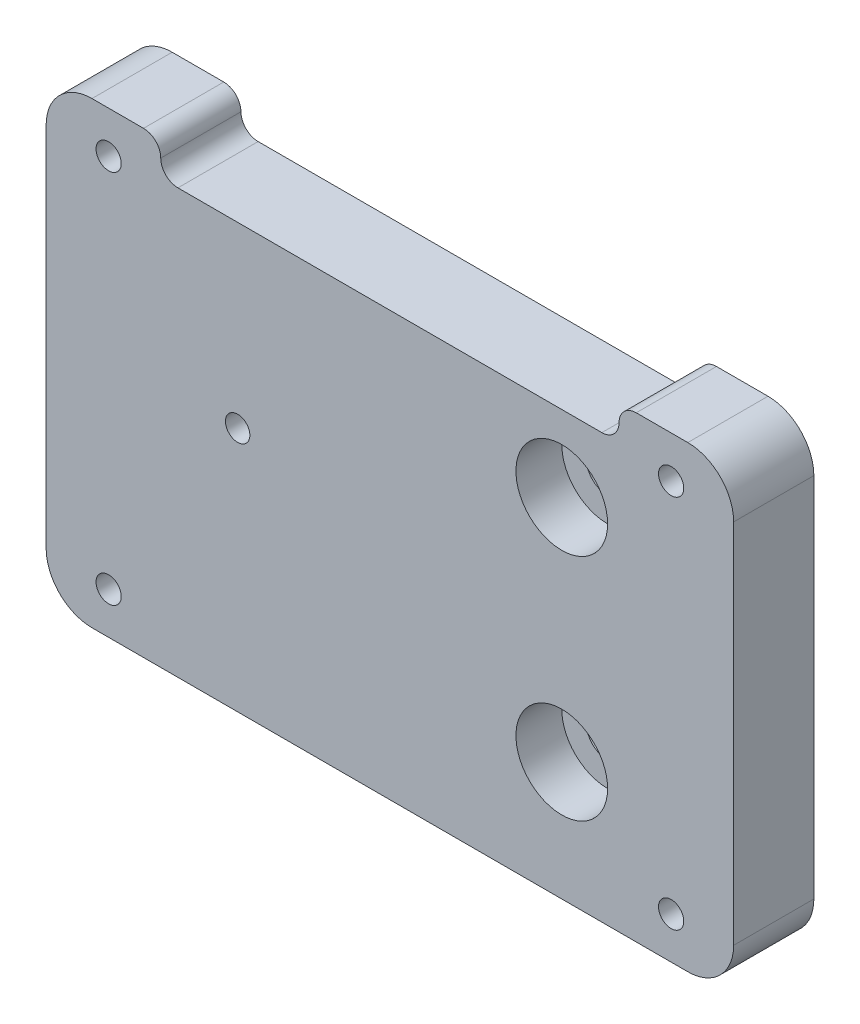
ISO-10303-21;
HEADER;
FILE_DESCRIPTION(('STEP AP214'),'2;1');
FILE_NAME('part.step','',(''),(''),'','','');
FILE_SCHEMA(('AUTOMOTIVE_DESIGN { 1 0 10303 214 1 1 1 1 }'));
ENDSEC;
DATA;
#1=APPLICATION_CONTEXT('core data for automotive mechanical design processes');
#2=APPLICATION_PROTOCOL_DEFINITION('international standard','automotive_design',2000,#1);
#3=PRODUCT_CONTEXT('',#1,'mechanical');
#4=PRODUCT('Part','Part','',(#3));
#5=PRODUCT_RELATED_PRODUCT_CATEGORY('part','',(#4));
#6=PRODUCT_DEFINITION_FORMATION('','',#4);
#7=PRODUCT_DEFINITION_CONTEXT('part definition',#1,'design');
#8=PRODUCT_DEFINITION('design','',#6,#7);
#9=PRODUCT_DEFINITION_SHAPE('','',#8);
#10=(LENGTH_UNIT() NAMED_UNIT(*) SI_UNIT(.MILLI.,.METRE.));
#11=(NAMED_UNIT(*) PLANE_ANGLE_UNIT() SI_UNIT($,.RADIAN.));
#12=(NAMED_UNIT(*) SI_UNIT($,.STERADIAN.) SOLID_ANGLE_UNIT());
#13=UNCERTAINTY_MEASURE_WITH_UNIT(LENGTH_MEASURE(1.E-05),#10,'distance_accuracy_value','');
#14=(GEOMETRIC_REPRESENTATION_CONTEXT(3) GLOBAL_UNCERTAINTY_ASSIGNED_CONTEXT((#13)) GLOBAL_UNIT_ASSIGNED_CONTEXT((#10,
#11,#12)) REPRESENTATION_CONTEXT('',''));
#15=CARTESIAN_POINT('',(0.,0.,0.));
#16=DIRECTION('',(0.,0.,1.));
#17=DIRECTION('',(1.,0.,0.));
#18=AXIS2_PLACEMENT_3D('',#15,#16,#17);
#19=CARTESIAN_POINT('',(0.,0.,8.89));
#20=DIRECTION('',(0.,0.,-1.));
#21=DIRECTION('',(-1.,0.,0.));
#22=AXIS2_PLACEMENT_3D('',#19,#20,#21);
#23=PLANE('',#22);
#24=CARTESIAN_POINT('',(19.05,13.1468525440541,8.89));
#25=DIRECTION('',(0.,0.,1.));
#26=DIRECTION('',(1.,0.,0.));
#27=AXIS2_PLACEMENT_3D('',#24,#25,#26);
#28=CIRCLE('',#27,5.08);
#29=CARTESIAN_POINT('',(24.13,13.1468525440541,8.89));
#30=VERTEX_POINT('',#29);
#31=EDGE_CURVE('E259',#30,#30,#28,.T.);
#32=ORIENTED_EDGE('',*,*,#31,.F.);
#33=EDGE_LOOP('',(#32));
#34=FACE_BOUND('',#33,.T.);
#35=CARTESIAN_POINT('',(19.05,-12.2531474559459,8.89));
#36=DIRECTION('',(0.,0.,1.));
#37=DIRECTION('',(1.,0.,0.));
#38=AXIS2_PLACEMENT_3D('',#35,#36,#37);
#39=CIRCLE('',#38,5.08);
#40=CARTESIAN_POINT('',(24.13,-12.2531474559459,8.89));
#41=VERTEX_POINT('',#40);
#42=EDGE_CURVE('E255',#41,#41,#39,.T.);
#43=ORIENTED_EDGE('',*,*,#42,.F.);
#44=EDGE_LOOP('',(#43));
#45=FACE_BOUND('',#44,.T.);
#46=DIRECTION('',(-1.,0.,0.));
#47=VECTOR('',#46,1.);
#48=CARTESIAN_POINT('',(-38.1,25.4,8.89));
#49=LINE('',#48,#47);
#50=CARTESIAN_POINT('',(33.02,25.4,8.89));
#51=VERTEX_POINT('',#50);
#52=CARTESIAN_POINT('',(27.305,25.4,8.89));
#53=VERTEX_POINT('',#52);
#54=EDGE_CURVE('E300',#51,#53,#49,.T.);
#55=ORIENTED_EDGE('',*,*,#54,.T.);
#56=CARTESIAN_POINT('',(27.305,23.495,8.89));
#57=DIRECTION('',(0.,0.,-1.));
#58=DIRECTION('',(-1.,0.,0.));
#59=AXIS2_PLACEMENT_3D('',#56,#57,#58);
#60=CIRCLE('',#59,1.905);
#61=CARTESIAN_POINT('',(25.4,23.495,8.89));
#62=VERTEX_POINT('',#61);
#63=EDGE_CURVE('E219',#53,#62,#60,.F.);
#64=ORIENTED_EDGE('',*,*,#63,.T.);
#65=CARTESIAN_POINT('',(23.495,23.495,8.89));
#66=DIRECTION('',(0.,0.,-1.));
#67=DIRECTION('',(-1.,0.,0.));
#68=AXIS2_PLACEMENT_3D('',#65,#66,#67);
#69=CIRCLE('',#68,1.905);
#70=CARTESIAN_POINT('',(23.495,21.59,8.89));
#71=VERTEX_POINT('',#70);
#72=EDGE_CURVE('E231',#62,#71,#69,.T.);
#73=ORIENTED_EDGE('',*,*,#72,.T.);
#74=DIRECTION('',(1.,0.,0.));
#75=VECTOR('',#74,1.);
#76=CARTESIAN_POINT('',(-25.4,21.59,8.89));
#77=LINE('',#76,#75);
#78=CARTESIAN_POINT('',(-23.495,21.59,8.89));
#79=VERTEX_POINT('',#78);
#80=EDGE_CURVE('E237',#79,#71,#77,.T.);
#81=ORIENTED_EDGE('',*,*,#80,.F.);
#82=CARTESIAN_POINT('',(-23.495,23.495,8.89));
#83=DIRECTION('',(0.,0.,-1.));
#84=DIRECTION('',(-1.,0.,0.));
#85=AXIS2_PLACEMENT_3D('',#82,#83,#84);
#86=CIRCLE('',#85,1.905);
#87=CARTESIAN_POINT('',(-25.4,23.495,8.89));
#88=VERTEX_POINT('',#87);
#89=EDGE_CURVE('E48',#79,#88,#86,.T.);
#90=ORIENTED_EDGE('',*,*,#89,.T.);
#91=CARTESIAN_POINT('',(-27.305,23.495,8.89));
#92=DIRECTION('',(0.,0.,-1.));
#93=DIRECTION('',(-1.,0.,0.));
#94=AXIS2_PLACEMENT_3D('',#91,#92,#93);
#95=CIRCLE('',#94,1.905);
#96=CARTESIAN_POINT('',(-27.305,25.4,8.89));
#97=VERTEX_POINT('',#96);
#98=EDGE_CURVE('E217',#88,#97,#95,.F.);
#99=ORIENTED_EDGE('',*,*,#98,.T.);
#100=CARTESIAN_POINT('',(-33.02,25.4,8.89));
#101=VERTEX_POINT('',#100);
#102=EDGE_CURVE('E299',#97,#101,#49,.T.);
#103=ORIENTED_EDGE('',*,*,#102,.T.);
#104=CARTESIAN_POINT('',(-33.02,20.32,8.89));
#105=DIRECTION('',(0.,0.,-1.));
#106=DIRECTION('',(-1.,0.,0.));
#107=AXIS2_PLACEMENT_3D('',#104,#105,#106);
#108=CIRCLE('',#107,5.08);
#109=CARTESIAN_POINT('',(-38.1,20.32,8.89));
#110=VERTEX_POINT('',#109);
#111=EDGE_CURVE('E194',#101,#110,#108,.F.);
#112=ORIENTED_EDGE('',*,*,#111,.T.);
#113=DIRECTION('',(0.,-1.,0.));
#114=VECTOR('',#113,1.);
#115=CARTESIAN_POINT('',(-38.1,-25.4,8.89));
#116=LINE('',#115,#114);
#117=CARTESIAN_POINT('',(-38.1,-20.32,8.89));
#118=VERTEX_POINT('',#117);
#119=EDGE_CURVE('E161',#110,#118,#116,.T.);
#120=ORIENTED_EDGE('',*,*,#119,.T.);
#121=CARTESIAN_POINT('',(-33.02,-20.32,8.89));
#122=DIRECTION('',(0.,0.,-1.));
#123=DIRECTION('',(-1.,0.,0.));
#124=AXIS2_PLACEMENT_3D('',#121,#122,#123);
#125=CIRCLE('',#124,5.08);
#126=CARTESIAN_POINT('',(-33.02,-25.4,8.89));
#127=VERTEX_POINT('',#126);
#128=EDGE_CURVE('E188',#118,#127,#125,.F.);
#129=ORIENTED_EDGE('',*,*,#128,.T.);
#130=DIRECTION('',(1.,0.,0.));
#131=VECTOR('',#130,1.);
#132=CARTESIAN_POINT('',(-38.1,-25.4,8.89));
#133=LINE('',#132,#131);
#134=CARTESIAN_POINT('',(33.02,-25.4,8.89));
#135=VERTEX_POINT('',#134);
#136=EDGE_CURVE('E179',#127,#135,#133,.T.);
#137=ORIENTED_EDGE('',*,*,#136,.T.);
#138=CARTESIAN_POINT('',(33.02,-20.32,8.89));
#139=DIRECTION('',(0.,0.,-1.));
#140=DIRECTION('',(-1.,0.,0.));
#141=AXIS2_PLACEMENT_3D('',#138,#139,#140);
#142=CIRCLE('',#141,5.08);
#143=CARTESIAN_POINT('',(38.1,-20.32,8.89));
#144=VERTEX_POINT('',#143);
#145=EDGE_CURVE('E192',#135,#144,#142,.F.);
#146=ORIENTED_EDGE('',*,*,#145,.T.);
#147=DIRECTION('',(0.,1.,0.));
#148=VECTOR('',#147,1.);
#149=CARTESIAN_POINT('',(38.1,-25.4,8.89));
#150=LINE('',#149,#148);
#151=CARTESIAN_POINT('',(38.1,20.32,8.89));
#152=VERTEX_POINT('',#151);
#153=EDGE_CURVE('E172',#144,#152,#150,.T.);
#154=ORIENTED_EDGE('',*,*,#153,.T.);
#155=CARTESIAN_POINT('',(33.02,20.32,8.89));
#156=DIRECTION('',(0.,0.,-1.));
#157=DIRECTION('',(-1.,0.,0.));
#158=AXIS2_PLACEMENT_3D('',#155,#156,#157);
#159=CIRCLE('',#158,5.08);
#160=EDGE_CURVE('E190',#152,#51,#159,.F.);
#161=ORIENTED_EDGE('',*,*,#160,.T.);
#162=EDGE_LOOP('',(#55,#64,#73,#81,#90,#99,#103,#112,#120,#129,#137,#146,#154,#161));
#163=FACE_BOUND('',#162,.T.);
#164=CARTESIAN_POINT('',(-31.1727642773673,-20.7818428515782,8.89));
#165=DIRECTION('',(0.,0.,1.));
#166=DIRECTION('',(1.,0.,0.));
#167=AXIS2_PLACEMENT_3D('',#164,#165,#166);
#168=CIRCLE('',#167,1.397);
#169=CARTESIAN_POINT('',(-29.7757642773673,-20.7818428515782,8.89));
#170=VERTEX_POINT('',#169);
#171=EDGE_CURVE('E291',#170,#170,#168,.T.);
#172=ORIENTED_EDGE('',*,*,#171,.F.);
#173=EDGE_LOOP('',(#172));
#174=FACE_BOUND('',#173,.T.);
#175=CARTESIAN_POINT('',(31.1727642773673,20.7818428515782,8.89));
#176=DIRECTION('',(0.,0.,1.));
#177=DIRECTION('',(1.,0.,0.));
#178=AXIS2_PLACEMENT_3D('',#175,#176,#177);
#179=CIRCLE('',#178,1.397);
#180=CARTESIAN_POINT('',(32.5697642773673,20.7818428515782,8.89));
#181=VERTEX_POINT('',#180);
#182=EDGE_CURVE('E285',#181,#181,#179,.T.);
#183=ORIENTED_EDGE('',*,*,#182,.F.);
#184=EDGE_LOOP('',(#183));
#185=FACE_BOUND('',#184,.T.);
#186=CARTESIAN_POINT('',(-31.1727642773673,20.7818428515782,8.89));
#187=DIRECTION('',(0.,0.,1.));
#188=DIRECTION('',(1.,0.,0.));
#189=AXIS2_PLACEMENT_3D('',#186,#187,#188);
#190=CIRCLE('',#189,1.397);
#191=CARTESIAN_POINT('',(-29.7757642773673,20.7818428515782,8.89));
#192=VERTEX_POINT('',#191);
#193=EDGE_CURVE('E279',#192,#192,#190,.T.);
#194=ORIENTED_EDGE('',*,*,#193,.F.);
#195=EDGE_LOOP('',(#194));
#196=FACE_BOUND('',#195,.T.);
#197=CARTESIAN_POINT('',(31.1727642773673,-20.7818428515782,8.89));
#198=DIRECTION('',(0.,0.,1.));
#199=DIRECTION('',(1.,0.,0.));
#200=AXIS2_PLACEMENT_3D('',#197,#198,#199);
#201=CIRCLE('',#200,1.397);
#202=CARTESIAN_POINT('',(32.5697642773673,-20.7818428515782,8.89));
#203=VERTEX_POINT('',#202);
#204=EDGE_CURVE('E273',#203,#203,#201,.T.);
#205=ORIENTED_EDGE('',*,*,#204,.F.);
#206=EDGE_LOOP('',(#205));
#207=FACE_BOUND('',#206,.T.);
#208=CARTESIAN_POINT('',(-16.8755683992146,1.82224458663782,8.89));
#209=DIRECTION('',(0.,0.,1.));
#210=DIRECTION('',(1.,0.,0.));
#211=AXIS2_PLACEMENT_3D('',#208,#209,#210);
#212=CIRCLE('',#211,1.35255);
#213=CARTESIAN_POINT('',(-15.5230183992146,1.82224458663782,8.89));
#214=VERTEX_POINT('',#213);
#215=EDGE_CURVE('E249',#214,#214,#212,.T.);
#216=ORIENTED_EDGE('',*,*,#215,.F.);
#217=EDGE_LOOP('',(#216));
#218=FACE_BOUND('',#217,.T.);
#219=ADVANCED_FACE('F39',(#34,#45,#163,#174,#185,#196,#207,#218),#23,.F.);
#220=CARTESIAN_POINT('',(0.,0.,0.));
#221=DIRECTION('',(0.,0.,-1.));
#222=DIRECTION('',(-1.,0.,0.));
#223=AXIS2_PLACEMENT_3D('',#220,#221,#222);
#224=PLANE('',#223);
#225=CARTESIAN_POINT('',(31.1727642773673,-20.7818428515782,0.));
#226=DIRECTION('',(0.,0.,1.));
#227=DIRECTION('',(1.,0.,0.));
#228=AXIS2_PLACEMENT_3D('',#225,#226,#227);
#229=CIRCLE('',#228,1.397);
#230=CARTESIAN_POINT('',(32.5697642773673,-20.7818428515782,0.));
#231=VERTEX_POINT('',#230);
#232=EDGE_CURVE('E270',#231,#231,#229,.T.);
#233=ORIENTED_EDGE('',*,*,#232,.T.);
#234=EDGE_LOOP('',(#233));
#235=FACE_BOUND('',#234,.T.);
#236=CARTESIAN_POINT('',(31.1727642773673,20.7818428515782,0.));
#237=DIRECTION('',(0.,0.,1.));
#238=DIRECTION('',(1.,0.,0.));
#239=AXIS2_PLACEMENT_3D('',#236,#237,#238);
#240=CIRCLE('',#239,1.397);
#241=CARTESIAN_POINT('',(32.5697642773673,20.7818428515782,0.));
#242=VERTEX_POINT('',#241);
#243=EDGE_CURVE('E282',#242,#242,#240,.T.);
#244=ORIENTED_EDGE('',*,*,#243,.T.);
#245=EDGE_LOOP('',(#244));
#246=FACE_BOUND('',#245,.T.);
#247=CARTESIAN_POINT('',(-31.1727642773673,-20.7818428515782,0.));
#248=DIRECTION('',(0.,0.,1.));
#249=DIRECTION('',(1.,0.,0.));
#250=AXIS2_PLACEMENT_3D('',#247,#248,#249);
#251=CIRCLE('',#250,1.397);
#252=CARTESIAN_POINT('',(-29.7757642773673,-20.7818428515782,0.));
#253=VERTEX_POINT('',#252);
#254=EDGE_CURVE('E288',#253,#253,#251,.T.);
#255=ORIENTED_EDGE('',*,*,#254,.T.);
#256=EDGE_LOOP('',(#255));
#257=FACE_BOUND('',#256,.T.);
#258=CARTESIAN_POINT('',(-31.1727642773673,20.7818428515782,0.));
#259=DIRECTION('',(0.,0.,1.));
#260=DIRECTION('',(1.,0.,0.));
#261=AXIS2_PLACEMENT_3D('',#258,#259,#260);
#262=CIRCLE('',#261,1.397);
#263=CARTESIAN_POINT('',(-29.7757642773673,20.7818428515782,0.));
#264=VERTEX_POINT('',#263);
#265=EDGE_CURVE('E276',#264,#264,#262,.T.);
#266=ORIENTED_EDGE('',*,*,#265,.T.);
#267=EDGE_LOOP('',(#266));
#268=FACE_BOUND('',#267,.T.);
#269=CARTESIAN_POINT('',(19.05,-12.2531474559459,0.));
#270=DIRECTION('',(0.,0.,1.));
#271=DIRECTION('',(1.,0.,0.));
#272=AXIS2_PLACEMENT_3D('',#269,#270,#271);
#273=CIRCLE('',#272,2.3701376154118);
#274=CARTESIAN_POINT('',(21.4201376154118,-12.2531474559459,0.));
#275=VERTEX_POINT('',#274);
#276=EDGE_CURVE('E214',#275,#275,#273,.T.);
#277=ORIENTED_EDGE('',*,*,#276,.T.);
#278=EDGE_LOOP('',(#277));
#279=FACE_BOUND('',#278,.T.);
#280=CARTESIAN_POINT('',(19.05,13.1468525440541,0.));
#281=DIRECTION('',(0.,0.,1.));
#282=DIRECTION('',(1.,0.,0.));
#283=AXIS2_PLACEMENT_3D('',#280,#281,#282);
#284=CIRCLE('',#283,2.3701376154118);
#285=CARTESIAN_POINT('',(21.4201376154118,13.1468525440541,0.));
#286=VERTEX_POINT('',#285);
#287=EDGE_CURVE('E267',#286,#286,#284,.T.);
#288=ORIENTED_EDGE('',*,*,#287,.T.);
#289=EDGE_LOOP('',(#288));
#290=FACE_BOUND('',#289,.T.);
#291=DIRECTION('',(1.,0.,0.));
#292=VECTOR('',#291,1.);
#293=CARTESIAN_POINT('',(-25.4,21.59,0.));
#294=LINE('',#293,#292);
#295=CARTESIAN_POINT('',(-23.495,21.59,0.));
#296=VERTEX_POINT('',#295);
#297=CARTESIAN_POINT('',(23.495,21.59,0.));
#298=VERTEX_POINT('',#297);
#299=EDGE_CURVE('E241',#296,#298,#294,.T.);
#300=ORIENTED_EDGE('',*,*,#299,.T.);
#301=CARTESIAN_POINT('',(23.495,23.495,0.));
#302=DIRECTION('',(0.,0.,-1.));
#303=DIRECTION('',(-1.,0.,0.));
#304=AXIS2_PLACEMENT_3D('',#301,#302,#303);
#305=CIRCLE('',#304,1.905);
#306=CARTESIAN_POINT('',(25.4,23.495,0.));
#307=VERTEX_POINT('',#306);
#308=EDGE_CURVE('E233',#298,#307,#305,.F.);
#309=ORIENTED_EDGE('',*,*,#308,.T.);
#310=CARTESIAN_POINT('',(27.305,23.495,0.));
#311=DIRECTION('',(0.,0.,-1.));
#312=DIRECTION('',(-1.,0.,0.));
#313=AXIS2_PLACEMENT_3D('',#310,#311,#312);
#314=CIRCLE('',#313,1.905);
#315=CARTESIAN_POINT('',(27.305,25.4,0.));
#316=VERTEX_POINT('',#315);
#317=EDGE_CURVE('E223',#307,#316,#314,.T.);
#318=ORIENTED_EDGE('',*,*,#317,.T.);
#319=DIRECTION('',(-1.,0.,0.));
#320=VECTOR('',#319,1.);
#321=CARTESIAN_POINT('',(-38.1,25.4,0.));
#322=LINE('',#321,#320);
#323=CARTESIAN_POINT('',(33.02,25.4,0.));
#324=VERTEX_POINT('',#323);
#325=EDGE_CURVE('E169',#324,#316,#322,.T.);
#326=ORIENTED_EDGE('',*,*,#325,.F.);
#327=CARTESIAN_POINT('',(33.02,20.32,0.));
#328=DIRECTION('',(0.,0.,-1.));
#329=DIRECTION('',(-1.,0.,0.));
#330=AXIS2_PLACEMENT_3D('',#327,#328,#329);
#331=CIRCLE('',#330,5.08);
#332=CARTESIAN_POINT('',(38.1,20.32,0.));
#333=VERTEX_POINT('',#332);
#334=EDGE_CURVE('E182',#324,#333,#331,.T.);
#335=ORIENTED_EDGE('',*,*,#334,.T.);
#336=DIRECTION('',(0.,1.,0.));
#337=VECTOR('',#336,1.);
#338=CARTESIAN_POINT('',(38.1,-25.4,0.));
#339=LINE('',#338,#337);
#340=CARTESIAN_POINT('',(38.1,-20.32,0.));
#341=VERTEX_POINT('',#340);
#342=EDGE_CURVE('E294',#341,#333,#339,.T.);
#343=ORIENTED_EDGE('',*,*,#342,.F.);
#344=CARTESIAN_POINT('',(33.02,-20.32,0.));
#345=DIRECTION('',(0.,0.,-1.));
#346=DIRECTION('',(-1.,0.,0.));
#347=AXIS2_PLACEMENT_3D('',#344,#345,#346);
#348=CIRCLE('',#347,5.08);
#349=CARTESIAN_POINT('',(33.02,-25.4,0.));
#350=VERTEX_POINT('',#349);
#351=EDGE_CURVE('E152',#341,#350,#348,.T.);
#352=ORIENTED_EDGE('',*,*,#351,.T.);
#353=DIRECTION('',(1.,0.,0.));
#354=VECTOR('',#353,1.);
#355=CARTESIAN_POINT('',(-38.1,-25.4,0.));
#356=LINE('',#355,#354);
#357=CARTESIAN_POINT('',(-33.02,-25.4,0.));
#358=VERTEX_POINT('',#357);
#359=EDGE_CURVE('E168',#358,#350,#356,.T.);
#360=ORIENTED_EDGE('',*,*,#359,.F.);
#361=CARTESIAN_POINT('',(-33.02,-20.32,0.));
#362=DIRECTION('',(0.,0.,-1.));
#363=DIRECTION('',(-1.,0.,0.));
#364=AXIS2_PLACEMENT_3D('',#361,#362,#363);
#365=CIRCLE('',#364,5.08);
#366=CARTESIAN_POINT('',(-38.1,-20.32,0.));
#367=VERTEX_POINT('',#366);
#368=EDGE_CURVE('E162',#358,#367,#365,.T.);
#369=ORIENTED_EDGE('',*,*,#368,.T.);
#370=DIRECTION('',(0.,-1.,0.));
#371=VECTOR('',#370,1.);
#372=CARTESIAN_POINT('',(-38.1,-25.4,0.));
#373=LINE('',#372,#371);
#374=CARTESIAN_POINT('',(-38.1,20.32,0.));
#375=VERTEX_POINT('',#374);
#376=EDGE_CURVE('E158',#375,#367,#373,.T.);
#377=ORIENTED_EDGE('',*,*,#376,.F.);
#378=CARTESIAN_POINT('',(-33.02,20.32,0.));
#379=DIRECTION('',(0.,0.,-1.));
#380=DIRECTION('',(-1.,0.,0.));
#381=AXIS2_PLACEMENT_3D('',#378,#379,#380);
#382=CIRCLE('',#381,5.08);
#383=CARTESIAN_POINT('',(-33.02,25.4,0.));
#384=VERTEX_POINT('',#383);
#385=EDGE_CURVE('E142',#375,#384,#382,.T.);
#386=ORIENTED_EDGE('',*,*,#385,.T.);
#387=CARTESIAN_POINT('',(-27.305,25.4,0.));
#388=VERTEX_POINT('',#387);
#389=EDGE_CURVE('E175',#388,#384,#322,.T.);
#390=ORIENTED_EDGE('',*,*,#389,.F.);
#391=CARTESIAN_POINT('',(-27.305,23.495,0.));
#392=DIRECTION('',(0.,0.,-1.));
#393=DIRECTION('',(-1.,0.,0.));
#394=AXIS2_PLACEMENT_3D('',#391,#392,#393);
#395=CIRCLE('',#394,1.905);
#396=CARTESIAN_POINT('',(-25.4,23.495,0.));
#397=VERTEX_POINT('',#396);
#398=EDGE_CURVE('E221',#388,#397,#395,.T.);
#399=ORIENTED_EDGE('',*,*,#398,.T.);
#400=CARTESIAN_POINT('',(-23.495,23.495,0.));
#401=DIRECTION('',(0.,0.,-1.));
#402=DIRECTION('',(-1.,0.,0.));
#403=AXIS2_PLACEMENT_3D('',#400,#401,#402);
#404=CIRCLE('',#403,1.905);
#405=EDGE_CURVE('E11',#397,#296,#404,.F.);
#406=ORIENTED_EDGE('',*,*,#405,.T.);
#407=EDGE_LOOP('',(#300,#309,#318,#326,#335,#343,#352,#360,#369,#377,#386,#390,#399,#406));
#408=FACE_BOUND('',#407,.T.);
#409=CARTESIAN_POINT('',(-16.8755683992146,1.82224458663782,0.));
#410=DIRECTION('',(0.,0.,1.));
#411=DIRECTION('',(1.,0.,0.));
#412=AXIS2_PLACEMENT_3D('',#409,#410,#411);
#413=CIRCLE('',#412,1.35255);
#414=CARTESIAN_POINT('',(-15.5230183992146,1.82224458663782,0.));
#415=VERTEX_POINT('',#414);
#416=EDGE_CURVE('E244',#415,#415,#413,.T.);
#417=ORIENTED_EDGE('',*,*,#416,.T.);
#418=EDGE_LOOP('',(#417));
#419=FACE_BOUND('',#418,.T.);
#420=ADVANCED_FACE('F165',(#235,#246,#257,#268,#279,#290,#408,#419),#224,.T.);
#421=CARTESIAN_POINT('',(-38.1,25.4,8.89));
#422=DIRECTION('',(0.,-1.,0.));
#423=DIRECTION('',(0.,0.,-1.));
#424=AXIS2_PLACEMENT_3D('',#421,#422,#423);
#425=PLANE('',#424);
#426=ORIENTED_EDGE('',*,*,#325,.T.);
#427=DIRECTION('',(0.,0.,1.));
#428=VECTOR('',#427,1.);
#429=CARTESIAN_POINT('',(27.305,25.4,8.89));
#430=LINE('',#429,#428);
#431=EDGE_CURVE('E206',#316,#53,#430,.T.);
#432=ORIENTED_EDGE('',*,*,#431,.T.);
#433=ORIENTED_EDGE('',*,*,#54,.F.);
#434=DIRECTION('',(0.,0.,-1.));
#435=VECTOR('',#434,1.);
#436=CARTESIAN_POINT('',(33.02,25.4,8.89));
#437=LINE('',#436,#435);
#438=EDGE_CURVE('E151',#51,#324,#437,.T.);
#439=ORIENTED_EDGE('',*,*,#438,.T.);
#440=EDGE_LOOP('',(#426,#432,#433,#439));
#441=FACE_BOUND('',#440,.T.);
#442=ADVANCED_FACE('F327',(#441),#425,.F.);
#443=CARTESIAN_POINT('',(19.05,-12.2531474559459,0.));
#444=DIRECTION('',(0.,0.,1.));
#445=DIRECTION('',(1.,0.,0.));
#446=AXIS2_PLACEMENT_3D('',#443,#444,#445);
#447=CYLINDRICAL_SURFACE('',#446,2.3701376154118);
#448=ORIENTED_EDGE('',*,*,#276,.F.);
#449=EDGE_LOOP('',(#448));
#450=FACE_BOUND('',#449,.T.);
#451=CARTESIAN_POINT('',(19.05,-12.2531474559459,3.81));
#452=DIRECTION('',(0.,0.,1.));
#453=DIRECTION('',(1.,0.,0.));
#454=AXIS2_PLACEMENT_3D('',#451,#452,#453);
#455=CIRCLE('',#454,2.3701376154118);
#456=CARTESIAN_POINT('',(21.4201376154118,-12.2531474559459,3.81));
#457=VERTEX_POINT('',#456);
#458=EDGE_CURVE('E210',#457,#457,#455,.F.);
#459=ORIENTED_EDGE('',*,*,#458,.F.);
#460=EDGE_LOOP('',(#459));
#461=FACE_BOUND('',#460,.T.);
#462=ADVANCED_FACE('F420',(#450,#461),#447,.F.);
#463=CARTESIAN_POINT('',(19.05,13.1468525440541,0.));
#464=DIRECTION('',(0.,0.,1.));
#465=DIRECTION('',(1.,0.,0.));
#466=AXIS2_PLACEMENT_3D('',#463,#464,#465);
#467=CYLINDRICAL_SURFACE('',#466,2.3701376154118);
#468=ORIENTED_EDGE('',*,*,#287,.F.);
#469=EDGE_LOOP('',(#468));
#470=FACE_BOUND('',#469,.T.);
#471=CARTESIAN_POINT('',(19.05,13.1468525440541,3.81));
#472=DIRECTION('',(0.,0.,1.));
#473=DIRECTION('',(1.,0.,0.));
#474=AXIS2_PLACEMENT_3D('',#471,#472,#473);
#475=CIRCLE('',#474,2.3701376154118);
#476=CARTESIAN_POINT('',(21.4201376154118,13.1468525440541,3.81));
#477=VERTEX_POINT('',#476);
#478=EDGE_CURVE('E207',#477,#477,#475,.F.);
#479=ORIENTED_EDGE('',*,*,#478,.F.);
#480=EDGE_LOOP('',(#479));
#481=FACE_BOUND('',#480,.T.);
#482=ADVANCED_FACE('F365',(#470,#481),#467,.F.);
#483=CARTESIAN_POINT('',(38.1,-25.4,8.89));
#484=DIRECTION('',(-1.,0.,0.));
#485=DIRECTION('',(0.,0.,1.));
#486=AXIS2_PLACEMENT_3D('',#483,#484,#485);
#487=PLANE('',#486);
#488=ORIENTED_EDGE('',*,*,#153,.F.);
#489=DIRECTION('',(0.,0.,-1.));
#490=VECTOR('',#489,1.);
#491=CARTESIAN_POINT('',(38.1,-20.32,8.89));
#492=LINE('',#491,#490);
#493=EDGE_CURVE('E198',#144,#341,#492,.T.);
#494=ORIENTED_EDGE('',*,*,#493,.T.);
#495=ORIENTED_EDGE('',*,*,#342,.T.);
#496=DIRECTION('',(0.,0.,-1.));
#497=VECTOR('',#496,1.);
#498=CARTESIAN_POINT('',(38.1,20.32,8.89));
#499=LINE('',#498,#497);
#500=EDGE_CURVE('E196',#333,#152,#499,.F.);
#501=ORIENTED_EDGE('',*,*,#500,.T.);
#502=EDGE_LOOP('',(#488,#494,#495,#501));
#503=FACE_BOUND('',#502,.T.);
#504=ADVANCED_FACE('F362',(#503),#487,.F.);
#505=ORIENTED_EDGE('',*,*,#102,.F.);
#506=DIRECTION('',(0.,0.,1.));
#507=VECTOR('',#506,1.);
#508=CARTESIAN_POINT('',(-27.305,25.4,8.89));
#509=LINE('',#508,#507);
#510=EDGE_CURVE('E228',#97,#388,#509,.F.);
#511=ORIENTED_EDGE('',*,*,#510,.T.);
#512=ORIENTED_EDGE('',*,*,#389,.T.);
#513=DIRECTION('',(0.,0.,-1.));
#514=VECTOR('',#513,1.);
#515=CARTESIAN_POINT('',(-33.02,25.4,8.89));
#516=LINE('',#515,#514);
#517=EDGE_CURVE('E148',#384,#101,#516,.F.);
#518=ORIENTED_EDGE('',*,*,#517,.T.);
#519=EDGE_LOOP('',(#505,#511,#512,#518));
#520=FACE_BOUND('',#519,.T.);
#521=ADVANCED_FACE('F311',(#520),#425,.F.);
#522=CARTESIAN_POINT('',(-38.1,-25.4,8.89));
#523=DIRECTION('',(1.,0.,0.));
#524=DIRECTION('',(0.,0.,-1.));
#525=AXIS2_PLACEMENT_3D('',#522,#523,#524);
#526=PLANE('',#525);
#527=ORIENTED_EDGE('',*,*,#119,.F.);
#528=DIRECTION('',(0.,0.,-1.));
#529=VECTOR('',#528,1.);
#530=CARTESIAN_POINT('',(-38.1,20.32,8.89));
#531=LINE('',#530,#529);
#532=EDGE_CURVE('E146',#110,#375,#531,.T.);
#533=ORIENTED_EDGE('',*,*,#532,.T.);
#534=ORIENTED_EDGE('',*,*,#376,.T.);
#535=DIRECTION('',(0.,0.,-1.));
#536=VECTOR('',#535,1.);
#537=CARTESIAN_POINT('',(-38.1,-20.32,8.89));
#538=LINE('',#537,#536);
#539=EDGE_CURVE('E163',#367,#118,#538,.F.);
#540=ORIENTED_EDGE('',*,*,#539,.T.);
#541=EDGE_LOOP('',(#527,#533,#534,#540));
#542=FACE_BOUND('',#541,.T.);
#543=ADVANCED_FACE('F157',(#542),#526,.F.);
#544=CARTESIAN_POINT('',(-38.1,-25.4,8.89));
#545=DIRECTION('',(0.,1.,0.));
#546=DIRECTION('',(0.,0.,1.));
#547=AXIS2_PLACEMENT_3D('',#544,#545,#546);
#548=PLANE('',#547);
#549=ORIENTED_EDGE('',*,*,#359,.T.);
#550=DIRECTION('',(0.,0.,-1.));
#551=VECTOR('',#550,1.);
#552=CARTESIAN_POINT('',(33.02,-25.4,8.89));
#553=LINE('',#552,#551);
#554=EDGE_CURVE('E204',#350,#135,#553,.F.);
#555=ORIENTED_EDGE('',*,*,#554,.T.);
#556=ORIENTED_EDGE('',*,*,#136,.F.);
#557=DIRECTION('',(0.,0.,-1.));
#558=VECTOR('',#557,1.);
#559=CARTESIAN_POINT('',(-33.02,-25.4,8.89));
#560=LINE('',#559,#558);
#561=EDGE_CURVE('E201',#127,#358,#560,.T.);
#562=ORIENTED_EDGE('',*,*,#561,.T.);
#563=EDGE_LOOP('',(#549,#555,#556,#562));
#564=FACE_BOUND('',#563,.T.);
#565=ADVANCED_FACE('F354',(#564),#548,.F.);
#566=CARTESIAN_POINT('',(-31.1727642773673,-20.7818428515782,8.89));
#567=DIRECTION('',(0.,0.,-1.));
#568=DIRECTION('',(-1.,0.,0.));
#569=AXIS2_PLACEMENT_3D('',#566,#567,#568);
#570=CYLINDRICAL_SURFACE('',#569,1.397);
#571=ORIENTED_EDGE('',*,*,#171,.T.);
#572=EDGE_LOOP('',(#571));
#573=FACE_BOUND('',#572,.T.);
#574=ORIENTED_EDGE('',*,*,#254,.F.);
#575=EDGE_LOOP('',(#574));
#576=FACE_BOUND('',#575,.T.);
#577=ADVANCED_FACE('F351',(#573,#576),#570,.F.);
#578=CARTESIAN_POINT('',(31.1727642773673,20.7818428515782,8.89));
#579=DIRECTION('',(0.,0.,-1.));
#580=DIRECTION('',(-1.,0.,0.));
#581=AXIS2_PLACEMENT_3D('',#578,#579,#580);
#582=CYLINDRICAL_SURFACE('',#581,1.397);
#583=ORIENTED_EDGE('',*,*,#182,.T.);
#584=EDGE_LOOP('',(#583));
#585=FACE_BOUND('',#584,.T.);
#586=ORIENTED_EDGE('',*,*,#243,.F.);
#587=EDGE_LOOP('',(#586));
#588=FACE_BOUND('',#587,.T.);
#589=ADVANCED_FACE('F430',(#585,#588),#582,.F.);
#590=CARTESIAN_POINT('',(-31.1727642773673,20.7818428515782,8.89));
#591=DIRECTION('',(0.,0.,-1.));
#592=DIRECTION('',(-1.,0.,0.));
#593=AXIS2_PLACEMENT_3D('',#590,#591,#592);
#594=CYLINDRICAL_SURFACE('',#593,1.397);
#595=ORIENTED_EDGE('',*,*,#193,.T.);
#596=EDGE_LOOP('',(#595));
#597=FACE_BOUND('',#596,.T.);
#598=ORIENTED_EDGE('',*,*,#265,.F.);
#599=EDGE_LOOP('',(#598));
#600=FACE_BOUND('',#599,.T.);
#601=ADVANCED_FACE('F427',(#597,#600),#594,.F.);
#602=CARTESIAN_POINT('',(31.1727642773673,-20.7818428515782,8.89));
#603=DIRECTION('',(0.,0.,-1.));
#604=DIRECTION('',(-1.,0.,0.));
#605=AXIS2_PLACEMENT_3D('',#602,#603,#604);
#606=CYLINDRICAL_SURFACE('',#605,1.397);
#607=ORIENTED_EDGE('',*,*,#204,.T.);
#608=EDGE_LOOP('',(#607));
#609=FACE_BOUND('',#608,.T.);
#610=ORIENTED_EDGE('',*,*,#232,.F.);
#611=EDGE_LOOP('',(#610));
#612=FACE_BOUND('',#611,.T.);
#613=ADVANCED_FACE('F369',(#609,#612),#606,.F.);
#614=CARTESIAN_POINT('',(-33.02,20.32,8.89));
#615=DIRECTION('',(0.,0.,-1.));
#616=DIRECTION('',(-1.,0.,0.));
#617=AXIS2_PLACEMENT_3D('',#614,#615,#616);
#618=CYLINDRICAL_SURFACE('',#617,5.08);
#619=ORIENTED_EDGE('',*,*,#111,.F.);
#620=ORIENTED_EDGE('',*,*,#517,.F.);
#621=ORIENTED_EDGE('',*,*,#385,.F.);
#622=ORIENTED_EDGE('',*,*,#532,.F.);
#623=EDGE_LOOP('',(#619,#620,#621,#622));
#624=FACE_BOUND('',#623,.T.);
#625=ADVANCED_FACE('F145',(#624),#618,.T.);
#626=CARTESIAN_POINT('',(33.02,-20.32,8.89));
#627=DIRECTION('',(0.,0.,-1.));
#628=DIRECTION('',(-1.,0.,0.));
#629=AXIS2_PLACEMENT_3D('',#626,#627,#628);
#630=CYLINDRICAL_SURFACE('',#629,5.08);
#631=ORIENTED_EDGE('',*,*,#145,.F.);
#632=ORIENTED_EDGE('',*,*,#554,.F.);
#633=ORIENTED_EDGE('',*,*,#351,.F.);
#634=ORIENTED_EDGE('',*,*,#493,.F.);
#635=EDGE_LOOP('',(#631,#632,#633,#634));
#636=FACE_BOUND('',#635,.T.);
#637=ADVANCED_FACE('F368',(#636),#630,.T.);
#638=CARTESIAN_POINT('',(33.02,20.32,8.89));
#639=DIRECTION('',(0.,0.,-1.));
#640=DIRECTION('',(-1.,0.,0.));
#641=AXIS2_PLACEMENT_3D('',#638,#639,#640);
#642=CYLINDRICAL_SURFACE('',#641,5.08);
#643=ORIENTED_EDGE('',*,*,#160,.F.);
#644=ORIENTED_EDGE('',*,*,#500,.F.);
#645=ORIENTED_EDGE('',*,*,#334,.F.);
#646=ORIENTED_EDGE('',*,*,#438,.F.);
#647=EDGE_LOOP('',(#643,#644,#645,#646));
#648=FACE_BOUND('',#647,.T.);
#649=ADVANCED_FACE('F372',(#648),#642,.T.);
#650=CARTESIAN_POINT('',(-33.02,-20.32,8.89));
#651=DIRECTION('',(0.,0.,-1.));
#652=DIRECTION('',(-1.,0.,0.));
#653=AXIS2_PLACEMENT_3D('',#650,#651,#652);
#654=CYLINDRICAL_SURFACE('',#653,5.08);
#655=ORIENTED_EDGE('',*,*,#128,.F.);
#656=ORIENTED_EDGE('',*,*,#539,.F.);
#657=ORIENTED_EDGE('',*,*,#368,.F.);
#658=ORIENTED_EDGE('',*,*,#561,.F.);
#659=EDGE_LOOP('',(#655,#656,#657,#658));
#660=FACE_BOUND('',#659,.T.);
#661=ADVANCED_FACE('F375',(#660),#654,.T.);
#662=CARTESIAN_POINT('',(19.05,13.1468525440541,3.81));
#663=DIRECTION('',(0.,0.,1.));
#664=DIRECTION('',(1.,0.,0.));
#665=AXIS2_PLACEMENT_3D('',#662,#663,#664);
#666=PLANE('',#665);
#667=CARTESIAN_POINT('',(19.05,13.1468525440541,3.81));
#668=DIRECTION('',(0.,0.,1.));
#669=DIRECTION('',(1.,0.,0.));
#670=AXIS2_PLACEMENT_3D('',#667,#668,#669);
#671=CIRCLE('',#670,5.08);
#672=CARTESIAN_POINT('',(24.13,13.1468525440541,3.81));
#673=VERTEX_POINT('',#672);
#674=EDGE_CURVE('E211',#673,#673,#671,.T.);
#675=ORIENTED_EDGE('',*,*,#674,.T.);
#676=EDGE_LOOP('',(#675));
#677=FACE_BOUND('',#676,.T.);
#678=ORIENTED_EDGE('',*,*,#478,.T.);
#679=EDGE_LOOP('',(#678));
#680=FACE_BOUND('',#679,.T.);
#681=ADVANCED_FACE('F378',(#677,#680),#666,.T.);
#682=CARTESIAN_POINT('',(19.05,13.1468525440541,3.81));
#683=DIRECTION('',(0.,0.,1.));
#684=DIRECTION('',(1.,0.,0.));
#685=AXIS2_PLACEMENT_3D('',#682,#683,#684);
#686=CYLINDRICAL_SURFACE('',#685,5.08);
#687=ORIENTED_EDGE('',*,*,#674,.F.);
#688=EDGE_LOOP('',(#687));
#689=FACE_BOUND('',#688,.T.);
#690=ORIENTED_EDGE('',*,*,#31,.T.);
#691=EDGE_LOOP('',(#690));
#692=FACE_BOUND('',#691,.T.);
#693=ADVANCED_FACE('F383',(#689,#692),#686,.F.);
#694=CARTESIAN_POINT('',(19.05,-12.2531474559459,3.81));
#695=DIRECTION('',(0.,0.,1.));
#696=DIRECTION('',(1.,0.,0.));
#697=AXIS2_PLACEMENT_3D('',#694,#695,#696);
#698=PLANE('',#697);
#699=CARTESIAN_POINT('',(19.05,-12.2531474559459,3.81));
#700=DIRECTION('',(0.,0.,1.));
#701=DIRECTION('',(1.,0.,0.));
#702=AXIS2_PLACEMENT_3D('',#699,#700,#701);
#703=CIRCLE('',#702,5.08);
#704=CARTESIAN_POINT('',(24.13,-12.2531474559459,3.81));
#705=VERTEX_POINT('',#704);
#706=EDGE_CURVE('E262',#705,#705,#703,.T.);
#707=ORIENTED_EDGE('',*,*,#706,.T.);
#708=EDGE_LOOP('',(#707));
#709=FACE_BOUND('',#708,.T.);
#710=ORIENTED_EDGE('',*,*,#458,.T.);
#711=EDGE_LOOP('',(#710));
#712=FACE_BOUND('',#711,.T.);
#713=ADVANCED_FACE('F410',(#709,#712),#698,.T.);
#714=CARTESIAN_POINT('',(19.05,-12.2531474559459,3.81));
#715=DIRECTION('',(0.,0.,1.));
#716=DIRECTION('',(1.,0.,0.));
#717=AXIS2_PLACEMENT_3D('',#714,#715,#716);
#718=CYLINDRICAL_SURFACE('',#717,5.08);
#719=ORIENTED_EDGE('',*,*,#706,.F.);
#720=EDGE_LOOP('',(#719));
#721=FACE_BOUND('',#720,.T.);
#722=ORIENTED_EDGE('',*,*,#42,.T.);
#723=EDGE_LOOP('',(#722));
#724=FACE_BOUND('',#723,.T.);
#725=ADVANCED_FACE('F406',(#721,#724),#718,.F.);
#726=CARTESIAN_POINT('',(-25.4,21.59,0.));
#727=DIRECTION('',(0.,-1.,0.));
#728=DIRECTION('',(0.,0.,-1.));
#729=AXIS2_PLACEMENT_3D('',#726,#727,#728);
#730=PLANE('',#729);
#731=ORIENTED_EDGE('',*,*,#80,.T.);
#732=DIRECTION('',(0.,0.,1.));
#733=VECTOR('',#732,1.);
#734=CARTESIAN_POINT('',(23.495,21.59,0.));
#735=LINE('',#734,#733);
#736=EDGE_CURVE('E56',#71,#298,#735,.F.);
#737=ORIENTED_EDGE('',*,*,#736,.T.);
#738=ORIENTED_EDGE('',*,*,#299,.F.);
#739=DIRECTION('',(0.,0.,1.));
#740=VECTOR('',#739,1.);
#741=CARTESIAN_POINT('',(-23.495,21.59,8.89));
#742=LINE('',#741,#740);
#743=EDGE_CURVE('E225',#296,#79,#742,.T.);
#744=ORIENTED_EDGE('',*,*,#743,.T.);
#745=EDGE_LOOP('',(#731,#737,#738,#744));
#746=FACE_BOUND('',#745,.T.);
#747=ADVANCED_FACE('F317',(#746),#730,.F.);
#748=CARTESIAN_POINT('',(23.495,23.495,0.));
#749=DIRECTION('',(0.,0.,-1.));
#750=DIRECTION('',(-1.,0.,0.));
#751=AXIS2_PLACEMENT_3D('',#748,#749,#750);
#752=CYLINDRICAL_SURFACE('',#751,1.905);
#753=DIRECTION('',(0.,0.,1.));
#754=VECTOR('',#753,1.);
#755=CARTESIAN_POINT('',(25.4,23.495,8.89));
#756=LINE('',#755,#754);
#757=EDGE_CURVE('E235',#307,#62,#756,.T.);
#758=ORIENTED_EDGE('',*,*,#757,.F.);
#759=ORIENTED_EDGE('',*,*,#308,.F.);
#760=ORIENTED_EDGE('',*,*,#736,.F.);
#761=ORIENTED_EDGE('',*,*,#72,.F.);
#762=EDGE_LOOP('',(#758,#759,#760,#761));
#763=FACE_BOUND('',#762,.T.);
#764=ADVANCED_FACE('F322',(#763),#752,.F.);
#765=CARTESIAN_POINT('',(27.305,23.495,8.89));
#766=DIRECTION('',(0.,0.,1.));
#767=DIRECTION('',(1.,0.,0.));
#768=AXIS2_PLACEMENT_3D('',#765,#766,#767);
#769=CYLINDRICAL_SURFACE('',#768,1.905);
#770=ORIENTED_EDGE('',*,*,#317,.F.);
#771=ORIENTED_EDGE('',*,*,#757,.T.);
#772=ORIENTED_EDGE('',*,*,#63,.F.);
#773=ORIENTED_EDGE('',*,*,#431,.F.);
#774=EDGE_LOOP('',(#770,#771,#772,#773));
#775=FACE_BOUND('',#774,.T.);
#776=ADVANCED_FACE('F330',(#775),#769,.T.);
#777=CARTESIAN_POINT('',(-23.495,23.495,0.));
#778=DIRECTION('',(0.,0.,-1.));
#779=DIRECTION('',(-1.,0.,0.));
#780=AXIS2_PLACEMENT_3D('',#777,#778,#779);
#781=CYLINDRICAL_SURFACE('',#780,1.905);
#782=ORIENTED_EDGE('',*,*,#743,.F.);
#783=ORIENTED_EDGE('',*,*,#405,.F.);
#784=DIRECTION('',(0.,0.,1.));
#785=VECTOR('',#784,1.);
#786=CARTESIAN_POINT('',(-25.4,23.495,0.));
#787=LINE('',#786,#785);
#788=EDGE_CURVE('E43',#88,#397,#787,.F.);
#789=ORIENTED_EDGE('',*,*,#788,.F.);
#790=ORIENTED_EDGE('',*,*,#89,.F.);
#791=EDGE_LOOP('',(#782,#783,#789,#790));
#792=FACE_BOUND('',#791,.T.);
#793=ADVANCED_FACE('F41',(#792),#781,.F.);
#794=CARTESIAN_POINT('',(-27.305,23.495,0.));
#795=DIRECTION('',(0.,0.,1.));
#796=DIRECTION('',(1.,0.,0.));
#797=AXIS2_PLACEMENT_3D('',#794,#795,#796);
#798=CYLINDRICAL_SURFACE('',#797,1.905);
#799=ORIENTED_EDGE('',*,*,#398,.F.);
#800=ORIENTED_EDGE('',*,*,#510,.F.);
#801=ORIENTED_EDGE('',*,*,#98,.F.);
#802=ORIENTED_EDGE('',*,*,#788,.T.);
#803=EDGE_LOOP('',(#799,#800,#801,#802));
#804=FACE_BOUND('',#803,.T.);
#805=ADVANCED_FACE('F337',(#804),#798,.T.);
#806=CARTESIAN_POINT('',(-16.8755683992146,1.82224458663782,8.89));
#807=DIRECTION('',(0.,0.,1.));
#808=DIRECTION('',(1.,0.,0.));
#809=AXIS2_PLACEMENT_3D('',#806,#807,#808);
#810=CYLINDRICAL_SURFACE('',#809,1.35255);
#811=ORIENTED_EDGE('',*,*,#416,.F.);
#812=EDGE_LOOP('',(#811));
#813=FACE_BOUND('',#812,.T.);
#814=ORIENTED_EDGE('',*,*,#215,.T.);
#815=EDGE_LOOP('',(#814));
#816=FACE_BOUND('',#815,.T.);
#817=ADVANCED_FACE('F395',(#813,#816),#810,.F.);
#818=CLOSED_SHELL('',(#219,#420,#442,#462,#482,#504,#521,#543,#565,#577,#589,#601,#613,#625,
#637,#649,#661,#681,#693,#713,#725,#747,#764,#776,#793,#805,#817));
#819=MANIFOLD_SOLID_BREP('B2',#818);
#820=ADVANCED_BREP_SHAPE_REPRESENTATION('',(#18,#819),#14);
#821=SHAPE_DEFINITION_REPRESENTATION(#9,#820);
ENDSEC;
END-ISO-10303-21;
